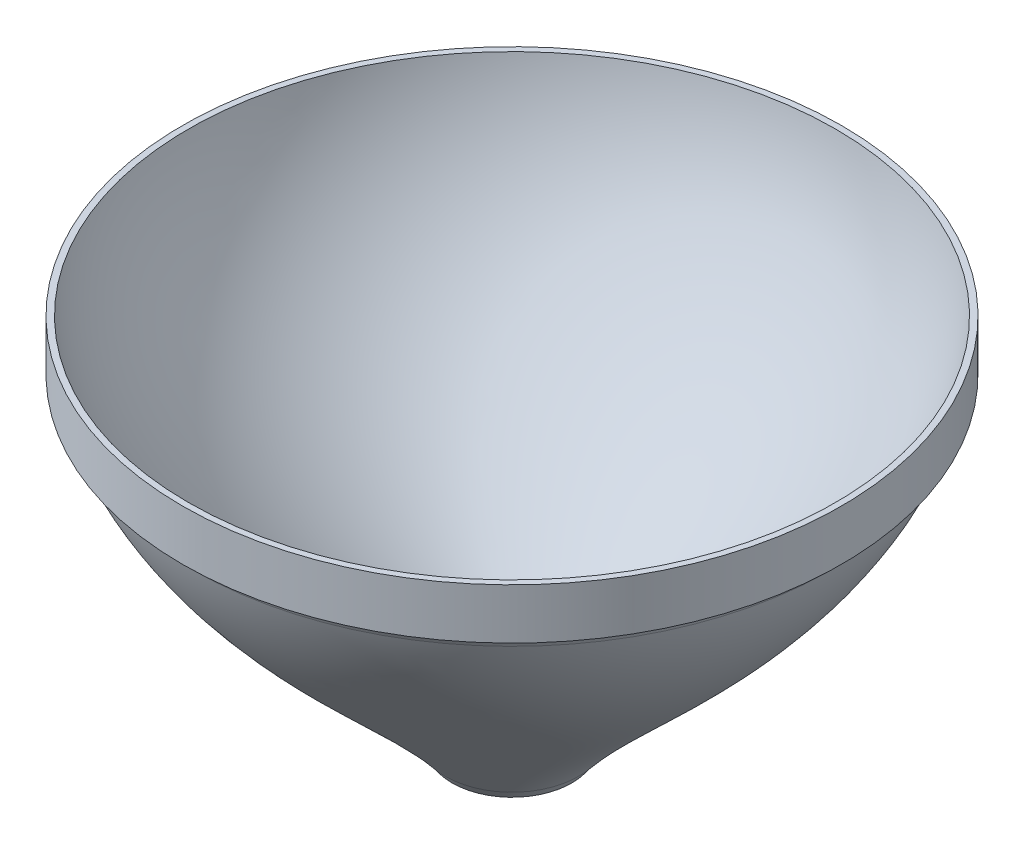
ISO-10303-21;
HEADER;
FILE_DESCRIPTION(('STEP AP214'),'2;1');
FILE_NAME('part.step','',(''),(''),'','','');
FILE_SCHEMA(('AUTOMOTIVE_DESIGN { 1 0 10303 214 1 1 1 1 }'));
ENDSEC;
DATA;
#1=APPLICATION_CONTEXT('core data for automotive mechanical design processes');
#2=APPLICATION_PROTOCOL_DEFINITION('international standard','automotive_design',2000,#1);
#3=PRODUCT_CONTEXT('',#1,'mechanical');
#4=PRODUCT('Part','Part','',(#3));
#5=PRODUCT_RELATED_PRODUCT_CATEGORY('part','',(#4));
#6=PRODUCT_DEFINITION_FORMATION('','',#4);
#7=PRODUCT_DEFINITION_CONTEXT('part definition',#1,'design');
#8=PRODUCT_DEFINITION('design','',#6,#7);
#9=PRODUCT_DEFINITION_SHAPE('','',#8);
#10=(LENGTH_UNIT() NAMED_UNIT(*) SI_UNIT(.MILLI.,.METRE.));
#11=(NAMED_UNIT(*) PLANE_ANGLE_UNIT() SI_UNIT($,.RADIAN.));
#12=(NAMED_UNIT(*) SI_UNIT($,.STERADIAN.) SOLID_ANGLE_UNIT());
#13=UNCERTAINTY_MEASURE_WITH_UNIT(LENGTH_MEASURE(1.E-05),#10,'distance_accuracy_value','');
#14=(GEOMETRIC_REPRESENTATION_CONTEXT(3) GLOBAL_UNCERTAINTY_ASSIGNED_CONTEXT((#13)) GLOBAL_UNIT_ASSIGNED_CONTEXT((#10,
#11,#12)) REPRESENTATION_CONTEXT('',''));
#15=CARTESIAN_POINT('',(0.,0.,0.));
#16=DIRECTION('',(0.,0.,1.));
#17=DIRECTION('',(1.,0.,0.));
#18=AXIS2_PLACEMENT_3D('',#15,#16,#17);
#19=CARTESIAN_POINT('',(24.834212463734,127.375382727049,0.));
#20=DIRECTION('',(0.,1.,0.));
#21=DIRECTION('',(0.,0.,1.));
#22=AXIS2_PLACEMENT_3D('',#19,#20,#21);
#23=CONICAL_SURFACE('',#22,42.3917637815564,0.417515702246654);
#24=CARTESIAN_POINT('',(24.834212463734,128.746531407015,0.));
#25=DIRECTION('',(0.,1.,0.));
#26=DIRECTION('',(0.,0.,1.));
#27=AXIS2_PLACEMENT_3D('',#24,#25,#26);
#28=CIRCLE('',#27,43.);
#29=CARTESIAN_POINT('',(24.834212463734,128.746531407015,43.));
#30=VERTEX_POINT('',#29);
#31=EDGE_CURVE('E59',#30,#30,#28,.T.);
#32=ORIENTED_EDGE('',*,*,#31,.F.);
#33=EDGE_LOOP('',(#32));
#34=FACE_BOUND('',#33,.T.);
#35=CARTESIAN_POINT('',(24.834212463734,127.375382727049,0.));
#36=DIRECTION('',(0.,1.,0.));
#37=DIRECTION('',(0.,0.,1.));
#38=AXIS2_PLACEMENT_3D('',#35,#36,#37);
#39=CIRCLE('',#38,42.3917637815564);
#40=CARTESIAN_POINT('',(24.834212463734,127.375382727049,42.3917637815564));
#41=VERTEX_POINT('',#40);
#42=EDGE_CURVE('E10',#41,#41,#39,.T.);
#43=ORIENTED_EDGE('',*,*,#42,.T.);
#44=EDGE_LOOP('',(#43));
#45=FACE_BOUND('',#44,.T.);
#46=ADVANCED_FACE('F31',(#34,#45),#23,.T.);
#47=CARTESIAN_POINT('',(-17.5575513178224,127.375382727049,0.));
#48=CARTESIAN_POINT('',(-17.1492520081636,126.282501552977,0.));
#49=CARTESIAN_POINT('',(-16.2378534169858,124.119682515728,0.));
#50=CARTESIAN_POINT('',(-14.1299790858232,120.024361386615,0.));
#51=CARTESIAN_POINT('',(-9.75405026022553,113.326334200117,0.));
#52=CARTESIAN_POINT('',(-3.63482426911894,106.585517876157,0.));
#53=CARTESIAN_POINT('',(2.77976600919618,100.345416981587,0.));
#54=CARTESIAN_POINT('',(7.53891556866818,95.8197129171618,0.));
#55=CARTESIAN_POINT('',(11.2889481310116,92.1067234369826,0.));
#56=CARTESIAN_POINT('',(14.0705452251797,89.1158502241109,0.));
#57=CARTESIAN_POINT('',(15.3532681215387,87.6299879998443,0.));
#58=CARTESIAN_POINT('',(15.9827816357336,86.8645280300717,0.));
#59=B_SPLINE_CURVE_WITH_KNOTS('',3,(#47,#48,#49,#50,#51,#52,#53,#54,#55,#56,#57,#58),
.UNSPECIFIED.,.F.,.F.,(4,1,1,1,1,1,1,1,1,4),(0.117144833399935,0.169312009430136,
0.221479185460337,0.325813537520738,0.534482241641541,0.638816593701942,0.743150945762344,
0.847485297822745,0.899652473852946,0.951819649883147),.UNSPECIFIED.);
#60=CARTESIAN_POINT('',(24.834212463734,148.471380654833,0.));
#61=DIRECTION('',(0.,1.,0.));
#62=AXIS1_PLACEMENT('',#60,#61);
#63=SURFACE_OF_REVOLUTION('',#59,#62);
#64=CARTESIAN_POINT('',(24.834212463734,86.8645280300718,0.));
#65=DIRECTION('',(0.,1.,0.));
#66=DIRECTION('',(0.,0.,1.));
#67=AXIS2_PLACEMENT_3D('',#64,#65,#66);
#68=CIRCLE('',#67,8.85143082800043);
#69=CARTESIAN_POINT('',(24.834212463734,86.8645280300718,8.85143082800043));
#70=VERTEX_POINT('',#69);
#71=EDGE_CURVE('E37',#70,#70,#68,.T.);
#72=ORIENTED_EDGE('',*,*,#71,.T.);
#73=EDGE_LOOP('',(#72));
#74=FACE_BOUND('',#73,.T.);
#75=ORIENTED_EDGE('',*,*,#42,.F.);
#76=EDGE_LOOP('',(#75));
#77=FACE_BOUND('',#76,.T.);
#78=ADVANCED_FACE('F86',(#74,#77),#63,.F.);
#79=CARTESIAN_POINT('',(24.834212463734,86.8645280300718,0.));
#80=DIRECTION('',(0.,1.,0.));
#81=DIRECTION('',(0.,0.,1.));
#82=AXIS2_PLACEMENT_3D('',#79,#80,#81);
#83=CONICAL_SURFACE('',#82,8.85143082800043,0.634559755875879);
#84=CARTESIAN_POINT('',(24.834212463734,85.6565288880275,0.));
#85=DIRECTION('',(0.,1.,0.));
#86=DIRECTION('',(0.,0.,1.));
#87=AXIS2_PLACEMENT_3D('',#84,#85,#86);
#88=CIRCLE('',#87,7.96219628480031);
#89=CARTESIAN_POINT('',(24.834212463734,85.6565288880275,7.96219628480031));
#90=VERTEX_POINT('',#89);
#91=EDGE_CURVE('E41',#90,#90,#88,.T.);
#92=ORIENTED_EDGE('',*,*,#91,.T.);
#93=EDGE_LOOP('',(#92));
#94=FACE_BOUND('',#93,.T.);
#95=ORIENTED_EDGE('',*,*,#71,.F.);
#96=EDGE_LOOP('',(#95));
#97=FACE_BOUND('',#96,.T.);
#98=ADVANCED_FACE('F83',(#94,#97),#83,.T.);
#99=CARTESIAN_POINT('',(0.,85.6565288880275,0.));
#100=DIRECTION('',(0.,1.,0.));
#101=DIRECTION('',(0.,0.,1.));
#102=AXIS2_PLACEMENT_3D('',#99,#100,#101);
#103=PLANE('',#102);
#104=ORIENTED_EDGE('',*,*,#91,.F.);
#105=EDGE_LOOP('',(#104));
#106=FACE_BOUND('',#105,.T.);
#107=CARTESIAN_POINT('',(24.834212463734,85.6565288880275,0.));
#108=DIRECTION('',(0.,1.,0.));
#109=DIRECTION('',(0.,0.,1.));
#110=AXIS2_PLACEMENT_3D('',#107,#108,#109);
#111=CIRCLE('',#110,6.);
#112=CARTESIAN_POINT('',(24.834212463734,85.6565288880275,6.));
#113=VERTEX_POINT('',#112);
#114=EDGE_CURVE('E45',#113,#113,#111,.T.);
#115=ORIENTED_EDGE('',*,*,#114,.T.);
#116=EDGE_LOOP('',(#115));
#117=FACE_BOUND('',#116,.T.);
#118=ADVANCED_FACE('F78',(#106,#117),#103,.F.);
#119=CARTESIAN_POINT('',(-18.1657875362659,135.456528888027,0.));
#120=CARTESIAN_POINT('',(-14.4545602595195,112.769537057464,0.));
#121=CARTESIAN_POINT('',(7.62293534352005,100.742541922729,0.));
#122=CARTESIAN_POINT('',(18.8342124637341,85.6565288880275,0.));
#123=B_SPLINE_CURVE_WITH_KNOTS('',3,(#119,#120,#121,#122),.UNSPECIFIED.,.F.,.F.,(4,4),(0.,1.),.UNSPECIFIED.);
#124=CARTESIAN_POINT('',(24.834212463734,148.471380654833,0.));
#125=DIRECTION('',(0.,1.,0.));
#126=AXIS1_PLACEMENT('',#124,#125);
#127=SURFACE_OF_REVOLUTION('',#123,#126);
#128=ORIENTED_EDGE('',*,*,#114,.F.);
#129=EDGE_LOOP('',(#128));
#130=FACE_BOUND('',#129,.T.);
#131=CARTESIAN_POINT('',(24.834212463734,135.456528888027,0.));
#132=DIRECTION('',(0.,1.,0.));
#133=DIRECTION('',(0.,0.,1.));
#134=AXIS2_PLACEMENT_3D('',#131,#132,#133);
#135=CIRCLE('',#134,43.);
#136=CARTESIAN_POINT('',(24.834212463734,135.456528888027,43.));
#137=VERTEX_POINT('',#136);
#138=EDGE_CURVE('E50',#137,#137,#135,.T.);
#139=ORIENTED_EDGE('',*,*,#138,.T.);
#140=EDGE_LOOP('',(#139));
#141=FACE_BOUND('',#140,.T.);
#142=ADVANCED_FACE('F73',(#130,#141),#127,.T.);
#143=CARTESIAN_POINT('',(4.69959241272782E-12,135.456528888027,0.));
#144=DIRECTION('',(0.,1.,0.));
#145=DIRECTION('',(0.,0.,1.));
#146=AXIS2_PLACEMENT_3D('',#143,#144,#145);
#147=PLANE('',#146);
#148=CARTESIAN_POINT('',(24.834212463734,135.456528888027,0.));
#149=DIRECTION('',(0.,1.,0.));
#150=DIRECTION('',(0.,0.,1.));
#151=AXIS2_PLACEMENT_3D('',#148,#149,#150);
#152=CIRCLE('',#151,43.8);
#153=CARTESIAN_POINT('',(24.834212463734,135.456528888027,43.8));
#154=VERTEX_POINT('',#153);
#155=EDGE_CURVE('E53',#154,#154,#152,.T.);
#156=ORIENTED_EDGE('',*,*,#155,.T.);
#157=EDGE_LOOP('',(#156));
#158=FACE_BOUND('',#157,.T.);
#159=ORIENTED_EDGE('',*,*,#138,.F.);
#160=EDGE_LOOP('',(#159));
#161=FACE_BOUND('',#160,.T.);
#162=ADVANCED_FACE('F77',(#158,#161),#147,.T.);
#163=CARTESIAN_POINT('',(24.834212463734,148.471380654833,0.));
#164=DIRECTION('',(0.,1.,0.));
#165=DIRECTION('',(0.,0.,1.));
#166=AXIS2_PLACEMENT_3D('',#163,#164,#165);
#167=CYLINDRICAL_SURFACE('',#166,43.8);
#168=CARTESIAN_POINT('',(24.834212463734,128.746531407015,0.));
#169=DIRECTION('',(0.,1.,0.));
#170=DIRECTION('',(0.,0.,1.));
#171=AXIS2_PLACEMENT_3D('',#168,#169,#170);
#172=CIRCLE('',#171,43.8);
#173=CARTESIAN_POINT('',(24.834212463734,128.746531407015,43.8));
#174=VERTEX_POINT('',#173);
#175=EDGE_CURVE('E56',#174,#174,#172,.T.);
#176=ORIENTED_EDGE('',*,*,#175,.T.);
#177=EDGE_LOOP('',(#176));
#178=FACE_BOUND('',#177,.T.);
#179=ORIENTED_EDGE('',*,*,#155,.F.);
#180=EDGE_LOOP('',(#179));
#181=FACE_BOUND('',#180,.T.);
#182=ADVANCED_FACE('F100',(#178,#181),#167,.T.);
#183=CARTESIAN_POINT('',(0.,128.746531407015,0.));
#184=DIRECTION('',(0.,1.,0.));
#185=DIRECTION('',(0.,0.,1.));
#186=AXIS2_PLACEMENT_3D('',#183,#184,#185);
#187=PLANE('',#186);
#188=ORIENTED_EDGE('',*,*,#175,.F.);
#189=EDGE_LOOP('',(#188));
#190=FACE_BOUND('',#189,.T.);
#191=ORIENTED_EDGE('',*,*,#31,.T.);
#192=EDGE_LOOP('',(#191));
#193=FACE_BOUND('',#192,.T.);
#194=ADVANCED_FACE('F98',(#190,#193),#187,.F.);
#195=CLOSED_SHELL('',(#46,#78,#98,#118,#142,#162,#182,#194));
#196=MANIFOLD_SOLID_BREP('B2',#195);
#197=ADVANCED_BREP_SHAPE_REPRESENTATION('',(#18,#196),#14);
#198=SHAPE_DEFINITION_REPRESENTATION(#9,#197);
ENDSEC;
END-ISO-10303-21;
